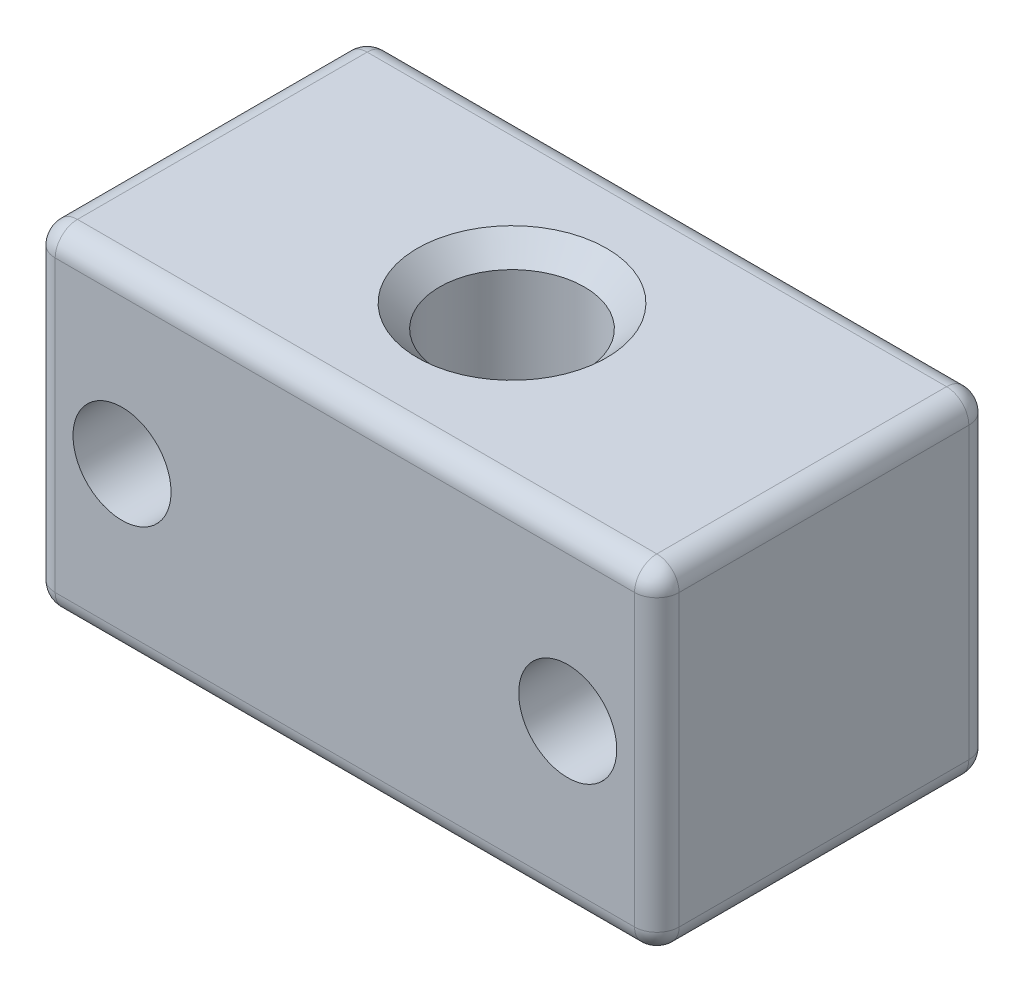
ISO-10303-21;
HEADER;
FILE_DESCRIPTION(('STEP AP214'),'2;1');
FILE_NAME('part.step','',(''),(''),'','','');
FILE_SCHEMA(('AUTOMOTIVE_DESIGN { 1 0 10303 214 1 1 1 1 }'));
ENDSEC;
DATA;
#1=APPLICATION_CONTEXT('core data for automotive mechanical design processes');
#2=APPLICATION_PROTOCOL_DEFINITION('international standard','automotive_design',2000,#1);
#3=PRODUCT_CONTEXT('',#1,'mechanical');
#4=PRODUCT('Part','Part','',(#3));
#5=PRODUCT_RELATED_PRODUCT_CATEGORY('part','',(#4));
#6=PRODUCT_DEFINITION_FORMATION('','',#4);
#7=PRODUCT_DEFINITION_CONTEXT('part definition',#1,'design');
#8=PRODUCT_DEFINITION('design','',#6,#7);
#9=PRODUCT_DEFINITION_SHAPE('','',#8);
#10=(LENGTH_UNIT() NAMED_UNIT(*) SI_UNIT(.MILLI.,.METRE.));
#11=(NAMED_UNIT(*) PLANE_ANGLE_UNIT() SI_UNIT($,.RADIAN.));
#12=(NAMED_UNIT(*) SI_UNIT($,.STERADIAN.) SOLID_ANGLE_UNIT());
#13=UNCERTAINTY_MEASURE_WITH_UNIT(LENGTH_MEASURE(1.E-05),#10,'distance_accuracy_value','');
#14=(GEOMETRIC_REPRESENTATION_CONTEXT(3) GLOBAL_UNCERTAINTY_ASSIGNED_CONTEXT((#13)) GLOBAL_UNIT_ASSIGNED_CONTEXT((#10,
#11,#12)) REPRESENTATION_CONTEXT('',''));
#15=CARTESIAN_POINT('',(0.,0.,0.));
#16=DIRECTION('',(0.,0.,1.));
#17=DIRECTION('',(1.,0.,0.));
#18=AXIS2_PLACEMENT_3D('',#15,#16,#17);
#19=CARTESIAN_POINT('',(0.,7.5,0.));
#20=DIRECTION('',(0.,-1.,0.));
#21=DIRECTION('',(0.,0.,-1.));
#22=AXIS2_PLACEMENT_3D('',#19,#20,#21);
#23=PLANE('',#22);
#24=CARTESIAN_POINT('',(0.,7.5,0.));
#25=DIRECTION('',(0.,-1.,0.));
#26=DIRECTION('',(0.,0.,-1.));
#27=AXIS2_PLACEMENT_3D('',#24,#25,#26);
#28=CIRCLE('',#27,4.25);
#29=CARTESIAN_POINT('',(0.,7.5,-4.25));
#30=VERTEX_POINT('',#29);
#31=EDGE_CURVE('E11',#30,#30,#28,.T.);
#32=ORIENTED_EDGE('',*,*,#31,.T.);
#33=EDGE_LOOP('',(#32));
#34=FACE_BOUND('',#33,.T.);
#35=DIRECTION('',(0.,0.,-1.));
#36=VECTOR('',#35,1.);
#37=CARTESIAN_POINT('',(13.,7.5,0.));
#38=LINE('',#37,#36);
#39=CARTESIAN_POINT('',(13.,7.5,6.5));
#40=VERTEX_POINT('',#39);
#41=CARTESIAN_POINT('',(13.,7.5,-6.5));
#42=VERTEX_POINT('',#41);
#43=EDGE_CURVE('E183',#40,#42,#38,.T.);
#44=ORIENTED_EDGE('',*,*,#43,.T.);
#45=DIRECTION('',(-1.,0.,0.));
#46=VECTOR('',#45,1.);
#47=CARTESIAN_POINT('',(0.,7.5,-6.5));
#48=LINE('',#47,#46);
#49=CARTESIAN_POINT('',(-13.,7.5,-6.5));
#50=VERTEX_POINT('',#49);
#51=EDGE_CURVE('E186',#42,#50,#48,.T.);
#52=ORIENTED_EDGE('',*,*,#51,.T.);
#53=DIRECTION('',(0.,0.,1.));
#54=VECTOR('',#53,1.);
#55=CARTESIAN_POINT('',(-13.,7.5,0.));
#56=LINE('',#55,#54);
#57=CARTESIAN_POINT('',(-13.,7.5,6.5));
#58=VERTEX_POINT('',#57);
#59=EDGE_CURVE('E181',#50,#58,#56,.T.);
#60=ORIENTED_EDGE('',*,*,#59,.T.);
#61=DIRECTION('',(1.,0.,0.));
#62=VECTOR('',#61,1.);
#63=CARTESIAN_POINT('',(0.,7.5,6.5));
#64=LINE('',#63,#62);
#65=EDGE_CURVE('E179',#58,#40,#64,.T.);
#66=ORIENTED_EDGE('',*,*,#65,.T.);
#67=EDGE_LOOP('',(#44,#52,#60,#66));
#68=FACE_BOUND('',#67,.T.);
#69=ADVANCED_FACE('F43',(#34,#68),#23,.F.);
#70=CARTESIAN_POINT('',(0.,-7.5,0.));
#71=DIRECTION('',(0.,-1.,0.));
#72=DIRECTION('',(0.,0.,-1.));
#73=AXIS2_PLACEMENT_3D('',#70,#71,#72);
#74=PLANE('',#73);
#75=CARTESIAN_POINT('',(0.,-7.5,0.));
#76=DIRECTION('',(0.,-1.,0.));
#77=DIRECTION('',(0.,0.,-1.));
#78=AXIS2_PLACEMENT_3D('',#75,#76,#77);
#79=CIRCLE('',#78,4.25);
#80=CARTESIAN_POINT('',(0.,-7.5,-4.25));
#81=VERTEX_POINT('',#80);
#82=EDGE_CURVE('E211',#81,#81,#79,.F.);
#83=ORIENTED_EDGE('',*,*,#82,.T.);
#84=EDGE_LOOP('',(#83));
#85=FACE_BOUND('',#84,.T.);
#86=DIRECTION('',(0.,0.,1.));
#87=VECTOR('',#86,1.);
#88=CARTESIAN_POINT('',(-13.,-7.5,-7.5));
#89=LINE('',#88,#87);
#90=CARTESIAN_POINT('',(-13.,-7.5,6.5));
#91=VERTEX_POINT('',#90);
#92=CARTESIAN_POINT('',(-13.,-7.5,-6.5));
#93=VERTEX_POINT('',#92);
#94=EDGE_CURVE('E199',#91,#93,#89,.F.);
#95=ORIENTED_EDGE('',*,*,#94,.T.);
#96=DIRECTION('',(-1.,0.,0.));
#97=VECTOR('',#96,1.);
#98=CARTESIAN_POINT('',(14.,-7.5,-6.5));
#99=LINE('',#98,#97);
#100=CARTESIAN_POINT('',(13.,-7.5,-6.5));
#101=VERTEX_POINT('',#100);
#102=EDGE_CURVE('E204',#93,#101,#99,.F.);
#103=ORIENTED_EDGE('',*,*,#102,.T.);
#104=DIRECTION('',(0.,0.,-1.));
#105=VECTOR('',#104,1.);
#106=CARTESIAN_POINT('',(13.,-7.5,7.5));
#107=LINE('',#106,#105);
#108=CARTESIAN_POINT('',(13.,-7.5,6.5));
#109=VERTEX_POINT('',#108);
#110=EDGE_CURVE('E201',#101,#109,#107,.F.);
#111=ORIENTED_EDGE('',*,*,#110,.T.);
#112=DIRECTION('',(1.,0.,0.));
#113=VECTOR('',#112,1.);
#114=CARTESIAN_POINT('',(-14.,-7.5,6.5));
#115=LINE('',#114,#113);
#116=EDGE_CURVE('E197',#109,#91,#115,.F.);
#117=ORIENTED_EDGE('',*,*,#116,.T.);
#118=EDGE_LOOP('',(#95,#103,#111,#117));
#119=FACE_BOUND('',#118,.T.);
#120=ADVANCED_FACE('F286',(#85,#119),#74,.T.);
#121=CARTESIAN_POINT('',(14.,7.5,7.5));
#122=DIRECTION('',(-1.,0.,0.));
#123=DIRECTION('',(0.,0.,1.));
#124=AXIS2_PLACEMENT_3D('',#121,#122,#123);
#125=PLANE('',#124);
#126=DIRECTION('',(0.,0.,-1.));
#127=VECTOR('',#126,1.);
#128=CARTESIAN_POINT('',(14.,6.5,7.5));
#129=LINE('',#128,#127);
#130=CARTESIAN_POINT('',(14.,6.5,-6.5));
#131=VERTEX_POINT('',#130);
#132=CARTESIAN_POINT('',(14.,6.5,6.5));
#133=VERTEX_POINT('',#132);
#134=EDGE_CURVE('E166',#131,#133,#129,.F.);
#135=ORIENTED_EDGE('',*,*,#134,.T.);
#136=DIRECTION('',(0.,-1.,0.));
#137=VECTOR('',#136,1.);
#138=CARTESIAN_POINT('',(14.,7.5,6.5));
#139=LINE('',#138,#137);
#140=CARTESIAN_POINT('',(14.,-6.5,6.5));
#141=VERTEX_POINT('',#140);
#142=EDGE_CURVE('E137',#133,#141,#139,.T.);
#143=ORIENTED_EDGE('',*,*,#142,.T.);
#144=DIRECTION('',(0.,0.,-1.));
#145=VECTOR('',#144,1.);
#146=CARTESIAN_POINT('',(14.,-6.5,-7.5));
#147=LINE('',#146,#145);
#148=CARTESIAN_POINT('',(14.,-6.5,-6.5));
#149=VERTEX_POINT('',#148);
#150=EDGE_CURVE('E155',#141,#149,#147,.T.);
#151=ORIENTED_EDGE('',*,*,#150,.T.);
#152=DIRECTION('',(0.,-1.,0.));
#153=VECTOR('',#152,1.);
#154=CARTESIAN_POINT('',(14.,7.5,-6.5));
#155=LINE('',#154,#153);
#156=EDGE_CURVE('E161',#149,#131,#155,.F.);
#157=ORIENTED_EDGE('',*,*,#156,.T.);
#158=EDGE_LOOP('',(#135,#143,#151,#157));
#159=FACE_BOUND('',#158,.T.);
#160=ADVANCED_FACE('F164',(#159),#125,.F.);
#161=CARTESIAN_POINT('',(-14.,7.5,-7.5));
#162=DIRECTION('',(0.,0.,1.));
#163=DIRECTION('',(1.,0.,0.));
#164=AXIS2_PLACEMENT_3D('',#161,#162,#163);
#165=PLANE('',#164);
#166=DIRECTION('',(0.,-1.,0.));
#167=VECTOR('',#166,1.);
#168=CARTESIAN_POINT('',(13.,7.5,-7.5));
#169=LINE('',#168,#167);
#170=CARTESIAN_POINT('',(13.,6.5,-7.5));
#171=VERTEX_POINT('',#170);
#172=CARTESIAN_POINT('',(13.,-6.5,-7.5));
#173=VERTEX_POINT('',#172);
#174=EDGE_CURVE('E192',#171,#173,#169,.T.);
#175=ORIENTED_EDGE('',*,*,#174,.T.);
#176=DIRECTION('',(-1.,0.,0.));
#177=VECTOR('',#176,1.);
#178=CARTESIAN_POINT('',(-14.,-6.5,-7.5));
#179=LINE('',#178,#177);
#180=CARTESIAN_POINT('',(-13.,-6.5,-7.5));
#181=VERTEX_POINT('',#180);
#182=EDGE_CURVE('E195',#173,#181,#179,.T.);
#183=ORIENTED_EDGE('',*,*,#182,.T.);
#184=DIRECTION('',(0.,-1.,0.));
#185=VECTOR('',#184,1.);
#186=CARTESIAN_POINT('',(-13.,7.5,-7.5));
#187=LINE('',#186,#185);
#188=CARTESIAN_POINT('',(-13.,6.5,-7.5));
#189=VERTEX_POINT('',#188);
#190=EDGE_CURVE('E190',#181,#189,#187,.F.);
#191=ORIENTED_EDGE('',*,*,#190,.T.);
#192=DIRECTION('',(-1.,0.,0.));
#193=VECTOR('',#192,1.);
#194=CARTESIAN_POINT('',(-14.,6.5,-7.5));
#195=LINE('',#194,#193);
#196=EDGE_CURVE('E188',#189,#171,#195,.F.);
#197=ORIENTED_EDGE('',*,*,#196,.T.);
#198=EDGE_LOOP('',(#175,#183,#191,#197));
#199=FACE_BOUND('',#198,.T.);
#200=CARTESIAN_POINT('',(-10.,0.,-7.5));
#201=DIRECTION('',(0.,0.,1.));
#202=DIRECTION('',(1.,0.,0.));
#203=AXIS2_PLACEMENT_3D('',#200,#201,#202);
#204=CIRCLE('',#203,2.2);
#205=CARTESIAN_POINT('',(-7.8,0.,-7.5));
#206=VERTEX_POINT('',#205);
#207=EDGE_CURVE('E162',#206,#206,#204,.T.);
#208=ORIENTED_EDGE('',*,*,#207,.T.);
#209=EDGE_LOOP('',(#208));
#210=FACE_BOUND('',#209,.T.);
#211=CARTESIAN_POINT('',(10.,0.,-7.5));
#212=DIRECTION('',(0.,0.,1.));
#213=DIRECTION('',(1.,0.,0.));
#214=AXIS2_PLACEMENT_3D('',#211,#212,#213);
#215=CIRCLE('',#214,2.2);
#216=CARTESIAN_POINT('',(12.2,0.,-7.5));
#217=VERTEX_POINT('',#216);
#218=EDGE_CURVE('E270',#217,#217,#215,.T.);
#219=ORIENTED_EDGE('',*,*,#218,.T.);
#220=EDGE_LOOP('',(#219));
#221=FACE_BOUND('',#220,.T.);
#222=ADVANCED_FACE('F325',(#199,#210,#221),#165,.F.);
#223=CARTESIAN_POINT('',(-14.,7.5,7.5));
#224=DIRECTION('',(1.,0.,0.));
#225=DIRECTION('',(0.,0.,-1.));
#226=AXIS2_PLACEMENT_3D('',#223,#224,#225);
#227=PLANE('',#226);
#228=DIRECTION('',(0.,0.,1.));
#229=VECTOR('',#228,1.);
#230=CARTESIAN_POINT('',(-14.,6.5,7.5));
#231=LINE('',#230,#229);
#232=CARTESIAN_POINT('',(-14.,6.5,6.5));
#233=VERTEX_POINT('',#232);
#234=CARTESIAN_POINT('',(-14.,6.5,-6.5));
#235=VERTEX_POINT('',#234);
#236=EDGE_CURVE('E59',#233,#235,#231,.F.);
#237=ORIENTED_EDGE('',*,*,#236,.T.);
#238=DIRECTION('',(0.,-1.,0.));
#239=VECTOR('',#238,1.);
#240=CARTESIAN_POINT('',(-14.,7.5,-6.5));
#241=LINE('',#240,#239);
#242=CARTESIAN_POINT('',(-14.,-6.5,-6.5));
#243=VERTEX_POINT('',#242);
#244=EDGE_CURVE('E210',#235,#243,#241,.T.);
#245=ORIENTED_EDGE('',*,*,#244,.T.);
#246=DIRECTION('',(0.,0.,1.));
#247=VECTOR('',#246,1.);
#248=CARTESIAN_POINT('',(-14.,-6.5,7.5));
#249=LINE('',#248,#247);
#250=CARTESIAN_POINT('',(-14.,-6.5,6.5));
#251=VERTEX_POINT('',#250);
#252=EDGE_CURVE('E206',#243,#251,#249,.T.);
#253=ORIENTED_EDGE('',*,*,#252,.T.);
#254=DIRECTION('',(0.,-1.,0.));
#255=VECTOR('',#254,1.);
#256=CARTESIAN_POINT('',(-14.,7.5,6.5));
#257=LINE('',#256,#255);
#258=EDGE_CURVE('E64',#251,#233,#257,.F.);
#259=ORIENTED_EDGE('',*,*,#258,.T.);
#260=EDGE_LOOP('',(#237,#245,#253,#259));
#261=FACE_BOUND('',#260,.T.);
#262=ADVANCED_FACE('F339',(#261),#227,.F.);
#263=CARTESIAN_POINT('',(-14.,7.5,7.5));
#264=DIRECTION('',(0.,0.,-1.));
#265=DIRECTION('',(-1.,0.,0.));
#266=AXIS2_PLACEMENT_3D('',#263,#264,#265);
#267=PLANE('',#266);
#268=DIRECTION('',(0.,-1.,0.));
#269=VECTOR('',#268,1.);
#270=CARTESIAN_POINT('',(-13.,7.5,7.5));
#271=LINE('',#270,#269);
#272=CARTESIAN_POINT('',(-13.,6.5,7.5));
#273=VERTEX_POINT('',#272);
#274=CARTESIAN_POINT('',(-13.,-6.5,7.5));
#275=VERTEX_POINT('',#274);
#276=EDGE_CURVE('E170',#273,#275,#271,.T.);
#277=ORIENTED_EDGE('',*,*,#276,.T.);
#278=DIRECTION('',(1.,0.,0.));
#279=VECTOR('',#278,1.);
#280=CARTESIAN_POINT('',(14.,-6.5,7.5));
#281=LINE('',#280,#279);
#282=CARTESIAN_POINT('',(13.,-6.5,7.5));
#283=VERTEX_POINT('',#282);
#284=EDGE_CURVE('E177',#275,#283,#281,.T.);
#285=ORIENTED_EDGE('',*,*,#284,.T.);
#286=DIRECTION('',(0.,-1.,0.));
#287=VECTOR('',#286,1.);
#288=CARTESIAN_POINT('',(13.,7.5,7.5));
#289=LINE('',#288,#287);
#290=CARTESIAN_POINT('',(13.,6.5,7.5));
#291=VERTEX_POINT('',#290);
#292=EDGE_CURVE('E139',#283,#291,#289,.F.);
#293=ORIENTED_EDGE('',*,*,#292,.T.);
#294=DIRECTION('',(1.,0.,0.));
#295=VECTOR('',#294,1.);
#296=CARTESIAN_POINT('',(-14.,6.5,7.5));
#297=LINE('',#296,#295);
#298=EDGE_CURVE('E168',#291,#273,#297,.F.);
#299=ORIENTED_EDGE('',*,*,#298,.T.);
#300=EDGE_LOOP('',(#277,#285,#293,#299));
#301=FACE_BOUND('',#300,.T.);
#302=CARTESIAN_POINT('',(-10.,0.,7.5));
#303=DIRECTION('',(0.,0.,1.));
#304=DIRECTION('',(1.,0.,0.));
#305=AXIS2_PLACEMENT_3D('',#302,#303,#304);
#306=CIRCLE('',#305,2.2);
#307=CARTESIAN_POINT('',(-7.8,0.,7.5));
#308=VERTEX_POINT('',#307);
#309=EDGE_CURVE('E319',#308,#308,#306,.T.);
#310=ORIENTED_EDGE('',*,*,#309,.F.);
#311=EDGE_LOOP('',(#310));
#312=FACE_BOUND('',#311,.T.);
#313=CARTESIAN_POINT('',(10.,0.,7.5));
#314=DIRECTION('',(0.,0.,1.));
#315=DIRECTION('',(1.,0.,0.));
#316=AXIS2_PLACEMENT_3D('',#313,#314,#315);
#317=CIRCLE('',#316,2.2);
#318=CARTESIAN_POINT('',(12.2,0.,7.5));
#319=VERTEX_POINT('',#318);
#320=EDGE_CURVE('E316',#319,#319,#317,.T.);
#321=ORIENTED_EDGE('',*,*,#320,.F.);
#322=EDGE_LOOP('',(#321));
#323=FACE_BOUND('',#322,.T.);
#324=ADVANCED_FACE('F336',(#301,#312,#323),#267,.F.);
#325=CARTESIAN_POINT('',(0.,7.5,0.));
#326=DIRECTION('',(0.,-1.,0.));
#327=DIRECTION('',(0.,0.,-1.));
#328=AXIS2_PLACEMENT_3D('',#325,#326,#327);
#329=CYLINDRICAL_SURFACE('',#328,3.25);
#330=CARTESIAN_POINT('',(0.,-6.49999999999999,0.));
#331=DIRECTION('',(0.,-1.,0.));
#332=DIRECTION('',(0.,0.,-1.));
#333=AXIS2_PLACEMENT_3D('',#330,#331,#332);
#334=CIRCLE('',#333,3.25);
#335=CARTESIAN_POINT('',(0.,-6.49999999999999,-3.25));
#336=VERTEX_POINT('',#335);
#337=EDGE_CURVE('E52',#336,#336,#334,.T.);
#338=ORIENTED_EDGE('',*,*,#337,.T.);
#339=EDGE_LOOP('',(#338));
#340=FACE_BOUND('',#339,.T.);
#341=CARTESIAN_POINT('',(0.,6.5,0.));
#342=DIRECTION('',(0.,-1.,0.));
#343=DIRECTION('',(0.,0.,-1.));
#344=AXIS2_PLACEMENT_3D('',#341,#342,#343);
#345=CIRCLE('',#344,3.25);
#346=CARTESIAN_POINT('',(0.,6.5,-3.25));
#347=VERTEX_POINT('',#346);
#348=EDGE_CURVE('E273',#347,#347,#345,.F.);
#349=ORIENTED_EDGE('',*,*,#348,.T.);
#350=EDGE_LOOP('',(#349));
#351=FACE_BOUND('',#350,.T.);
#352=ADVANCED_FACE('F278',(#340,#351),#329,.F.);
#353=CARTESIAN_POINT('',(10.,0.,-7.5));
#354=DIRECTION('',(0.,0.,1.));
#355=DIRECTION('',(1.,0.,0.));
#356=AXIS2_PLACEMENT_3D('',#353,#354,#355);
#357=CYLINDRICAL_SURFACE('',#356,2.2);
#358=ORIENTED_EDGE('',*,*,#218,.F.);
#359=EDGE_LOOP('',(#358));
#360=FACE_BOUND('',#359,.T.);
#361=ORIENTED_EDGE('',*,*,#320,.T.);
#362=EDGE_LOOP('',(#361));
#363=FACE_BOUND('',#362,.T.);
#364=ADVANCED_FACE('F332',(#360,#363),#357,.F.);
#365=CARTESIAN_POINT('',(-10.,0.,-7.5));
#366=DIRECTION('',(0.,0.,1.));
#367=DIRECTION('',(1.,0.,0.));
#368=AXIS2_PLACEMENT_3D('',#365,#366,#367);
#369=CYLINDRICAL_SURFACE('',#368,2.2);
#370=ORIENTED_EDGE('',*,*,#207,.F.);
#371=EDGE_LOOP('',(#370));
#372=FACE_BOUND('',#371,.T.);
#373=ORIENTED_EDGE('',*,*,#309,.T.);
#374=EDGE_LOOP('',(#373));
#375=FACE_BOUND('',#374,.T.);
#376=ADVANCED_FACE('F328',(#372,#375),#369,.F.);
#377=CARTESIAN_POINT('',(-13.,7.5,-6.5));
#378=DIRECTION('',(0.,-1.,0.));
#379=DIRECTION('',(0.,0.,-1.));
#380=AXIS2_PLACEMENT_3D('',#377,#378,#379);
#381=CYLINDRICAL_SURFACE('',#380,1.);
#382=CARTESIAN_POINT('',(-13.,6.5,-6.5));
#383=DIRECTION('',(0.,1.,0.));
#384=DIRECTION('',(0.,0.,1.));
#385=AXIS2_PLACEMENT_3D('',#382,#383,#384);
#386=CIRCLE('',#385,1.);
#387=EDGE_CURVE('E267',#189,#235,#386,.T.);
#388=ORIENTED_EDGE('',*,*,#387,.F.);
#389=ORIENTED_EDGE('',*,*,#190,.F.);
#390=CARTESIAN_POINT('',(-13.,-6.5,-6.5));
#391=DIRECTION('',(0.,-1.,0.));
#392=DIRECTION('',(0.,0.,-1.));
#393=AXIS2_PLACEMENT_3D('',#390,#391,#392);
#394=CIRCLE('',#393,1.);
#395=EDGE_CURVE('E264',#243,#181,#394,.T.);
#396=ORIENTED_EDGE('',*,*,#395,.F.);
#397=ORIENTED_EDGE('',*,*,#244,.F.);
#398=EDGE_LOOP('',(#388,#389,#396,#397));
#399=FACE_BOUND('',#398,.T.);
#400=ADVANCED_FACE('F331',(#399),#381,.T.);
#401=CARTESIAN_POINT('',(-13.,6.5,-6.5));
#402=DIRECTION('',(-1.,0.,0.));
#403=DIRECTION('',(0.,0.,1.));
#404=AXIS2_PLACEMENT_3D('',#401,#402,#403);
#405=SPHERICAL_SURFACE('',#404,1.);
#406=CARTESIAN_POINT('',(-13.,6.5,-6.5));
#407=DIRECTION('',(-1.,0.,0.));
#408=DIRECTION('',(0.,0.,1.));
#409=AXIS2_PLACEMENT_3D('',#406,#407,#408);
#410=CIRCLE('',#409,1.);
#411=EDGE_CURVE('E258',#189,#50,#410,.F.);
#412=ORIENTED_EDGE('',*,*,#411,.F.);
#413=ORIENTED_EDGE('',*,*,#387,.T.);
#414=CARTESIAN_POINT('',(-13.,6.5,-6.5));
#415=DIRECTION('',(0.,0.,-1.));
#416=DIRECTION('',(0.,1.,0.));
#417=AXIS2_PLACEMENT_3D('',#414,#415,#416);
#418=CIRCLE('',#417,1.);
#419=EDGE_CURVE('E261',#50,#235,#418,.F.);
#420=ORIENTED_EDGE('',*,*,#419,.F.);
#421=EDGE_LOOP('',(#412,#413,#420));
#422=FACE_BOUND('',#421,.T.);
#423=ADVANCED_FACE('F422',(#422),#405,.T.);
#424=CARTESIAN_POINT('',(-13.,-6.5,-6.5));
#425=DIRECTION('',(0.,0.,-1.));
#426=DIRECTION('',(0.,1.,0.));
#427=AXIS2_PLACEMENT_3D('',#424,#425,#426);
#428=SPHERICAL_SURFACE('',#427,1.);
#429=CARTESIAN_POINT('',(-13.,-6.5,-6.5));
#430=DIRECTION('',(0.,0.,-1.));
#431=DIRECTION('',(-1.,0.,0.));
#432=AXIS2_PLACEMENT_3D('',#429,#430,#431);
#433=CIRCLE('',#432,1.);
#434=EDGE_CURVE('E252',#243,#93,#433,.F.);
#435=ORIENTED_EDGE('',*,*,#434,.F.);
#436=ORIENTED_EDGE('',*,*,#395,.T.);
#437=CARTESIAN_POINT('',(-13.,-6.5,-6.5));
#438=DIRECTION('',(-1.,0.,0.));
#439=DIRECTION('',(0.,0.,1.));
#440=AXIS2_PLACEMENT_3D('',#437,#438,#439);
#441=CIRCLE('',#440,1.);
#442=EDGE_CURVE('E255',#93,#181,#441,.F.);
#443=ORIENTED_EDGE('',*,*,#442,.F.);
#444=EDGE_LOOP('',(#435,#436,#443));
#445=FACE_BOUND('',#444,.T.);
#446=ADVANCED_FACE('F300',(#445),#428,.T.);
#447=CARTESIAN_POINT('',(-13.,6.5,0.));
#448=DIRECTION('',(0.,0.,1.));
#449=DIRECTION('',(1.,0.,0.));
#450=AXIS2_PLACEMENT_3D('',#447,#448,#449);
#451=CYLINDRICAL_SURFACE('',#450,1.);
#452=ORIENTED_EDGE('',*,*,#419,.T.);
#453=ORIENTED_EDGE('',*,*,#236,.F.);
#454=CARTESIAN_POINT('',(-13.,6.5,6.5));
#455=DIRECTION('',(0.,0.,1.));
#456=DIRECTION('',(1.,0.,0.));
#457=AXIS2_PLACEMENT_3D('',#454,#455,#456);
#458=CIRCLE('',#457,1.);
#459=EDGE_CURVE('E246',#58,#233,#458,.T.);
#460=ORIENTED_EDGE('',*,*,#459,.F.);
#461=ORIENTED_EDGE('',*,*,#59,.F.);
#462=EDGE_LOOP('',(#452,#453,#460,#461));
#463=FACE_BOUND('',#462,.T.);
#464=ADVANCED_FACE('F415',(#463),#451,.T.);
#465=CARTESIAN_POINT('',(0.,6.5,-6.5));
#466=DIRECTION('',(-1.,0.,0.));
#467=DIRECTION('',(0.,0.,1.));
#468=AXIS2_PLACEMENT_3D('',#465,#466,#467);
#469=CYLINDRICAL_SURFACE('',#468,1.);
#470=ORIENTED_EDGE('',*,*,#411,.T.);
#471=ORIENTED_EDGE('',*,*,#51,.F.);
#472=CARTESIAN_POINT('',(13.,6.5,-6.5));
#473=DIRECTION('',(1.,0.,0.));
#474=DIRECTION('',(0.,0.,-1.));
#475=AXIS2_PLACEMENT_3D('',#472,#473,#474);
#476=CIRCLE('',#475,1.);
#477=EDGE_CURVE('E243',#171,#42,#476,.T.);
#478=ORIENTED_EDGE('',*,*,#477,.F.);
#479=ORIENTED_EDGE('',*,*,#196,.F.);
#480=EDGE_LOOP('',(#470,#471,#478,#479));
#481=FACE_BOUND('',#480,.T.);
#482=ADVANCED_FACE('F412',(#481),#469,.T.);
#483=CARTESIAN_POINT('',(13.,7.5,-6.5));
#484=DIRECTION('',(0.,-1.,0.));
#485=DIRECTION('',(0.,0.,-1.));
#486=AXIS2_PLACEMENT_3D('',#483,#484,#485);
#487=CYLINDRICAL_SURFACE('',#486,1.);
#488=CARTESIAN_POINT('',(13.,-6.5,-6.5));
#489=DIRECTION('',(0.,-1.,0.));
#490=DIRECTION('',(0.,0.,-1.));
#491=AXIS2_PLACEMENT_3D('',#488,#489,#490);
#492=CIRCLE('',#491,1.);
#493=EDGE_CURVE('E237',#173,#149,#492,.T.);
#494=ORIENTED_EDGE('',*,*,#493,.F.);
#495=ORIENTED_EDGE('',*,*,#174,.F.);
#496=CARTESIAN_POINT('',(13.,6.5,-6.5));
#497=DIRECTION('',(0.,1.,0.));
#498=DIRECTION('',(0.,0.,1.));
#499=AXIS2_PLACEMENT_3D('',#496,#497,#498);
#500=CIRCLE('',#499,1.);
#501=EDGE_CURVE('E240',#131,#171,#500,.T.);
#502=ORIENTED_EDGE('',*,*,#501,.F.);
#503=ORIENTED_EDGE('',*,*,#156,.F.);
#504=EDGE_LOOP('',(#494,#495,#502,#503));
#505=FACE_BOUND('',#504,.T.);
#506=ADVANCED_FACE('F309',(#505),#487,.T.);
#507=CARTESIAN_POINT('',(-14.,-6.5,-6.5));
#508=DIRECTION('',(1.,0.,0.));
#509=DIRECTION('',(0.,0.,-1.));
#510=AXIS2_PLACEMENT_3D('',#507,#508,#509);
#511=CYLINDRICAL_SURFACE('',#510,1.);
#512=ORIENTED_EDGE('',*,*,#442,.T.);
#513=ORIENTED_EDGE('',*,*,#182,.F.);
#514=CARTESIAN_POINT('',(13.,-6.5,-6.5));
#515=DIRECTION('',(1.,0.,0.));
#516=DIRECTION('',(0.,0.,-1.));
#517=AXIS2_PLACEMENT_3D('',#514,#515,#516);
#518=CIRCLE('',#517,1.);
#519=EDGE_CURVE('E235',#101,#173,#518,.T.);
#520=ORIENTED_EDGE('',*,*,#519,.F.);
#521=ORIENTED_EDGE('',*,*,#102,.F.);
#522=EDGE_LOOP('',(#512,#513,#520,#521));
#523=FACE_BOUND('',#522,.T.);
#524=ADVANCED_FACE('F303',(#523),#511,.T.);
#525=CARTESIAN_POINT('',(-13.,-6.5,7.5));
#526=DIRECTION('',(0.,0.,-1.));
#527=DIRECTION('',(-1.,0.,0.));
#528=AXIS2_PLACEMENT_3D('',#525,#526,#527);
#529=CYLINDRICAL_SURFACE('',#528,1.);
#530=ORIENTED_EDGE('',*,*,#434,.T.);
#531=ORIENTED_EDGE('',*,*,#94,.F.);
#532=CARTESIAN_POINT('',(-13.,-6.5,6.5));
#533=DIRECTION('',(0.,0.,1.));
#534=DIRECTION('',(1.,0.,0.));
#535=AXIS2_PLACEMENT_3D('',#532,#533,#534);
#536=CIRCLE('',#535,1.);
#537=EDGE_CURVE('E232',#251,#91,#536,.T.);
#538=ORIENTED_EDGE('',*,*,#537,.F.);
#539=ORIENTED_EDGE('',*,*,#252,.F.);
#540=EDGE_LOOP('',(#530,#531,#538,#539));
#541=FACE_BOUND('',#540,.T.);
#542=ADVANCED_FACE('F297',(#541),#529,.T.);
#543=CARTESIAN_POINT('',(-13.,7.5,6.5));
#544=DIRECTION('',(0.,-1.,0.));
#545=DIRECTION('',(0.,0.,-1.));
#546=AXIS2_PLACEMENT_3D('',#543,#544,#545);
#547=CYLINDRICAL_SURFACE('',#546,1.);
#548=CARTESIAN_POINT('',(-13.,6.5,6.5));
#549=DIRECTION('',(0.,1.,0.));
#550=DIRECTION('',(0.,0.,1.));
#551=AXIS2_PLACEMENT_3D('',#548,#549,#550);
#552=CIRCLE('',#551,1.);
#553=EDGE_CURVE('E249',#233,#273,#552,.T.);
#554=ORIENTED_EDGE('',*,*,#553,.F.);
#555=ORIENTED_EDGE('',*,*,#258,.F.);
#556=CARTESIAN_POINT('',(-13.,-6.5,6.5));
#557=DIRECTION('',(0.,-1.,0.));
#558=DIRECTION('',(0.,0.,-1.));
#559=AXIS2_PLACEMENT_3D('',#556,#557,#558);
#560=CIRCLE('',#559,1.);
#561=EDGE_CURVE('E229',#275,#251,#560,.T.);
#562=ORIENTED_EDGE('',*,*,#561,.F.);
#563=ORIENTED_EDGE('',*,*,#276,.F.);
#564=EDGE_LOOP('',(#554,#555,#562,#563));
#565=FACE_BOUND('',#564,.T.);
#566=ADVANCED_FACE('F401',(#565),#547,.T.);
#567=CARTESIAN_POINT('',(-13.,6.5,6.5));
#568=DIRECTION('',(-1.,0.,0.));
#569=DIRECTION('',(0.,0.,1.));
#570=AXIS2_PLACEMENT_3D('',#567,#568,#569);
#571=SPHERICAL_SURFACE('',#570,1.);
#572=ORIENTED_EDGE('',*,*,#459,.T.);
#573=ORIENTED_EDGE('',*,*,#553,.T.);
#574=CARTESIAN_POINT('',(-13.,6.5,6.5));
#575=DIRECTION('',(-1.,0.,0.));
#576=DIRECTION('',(0.,0.,1.));
#577=AXIS2_PLACEMENT_3D('',#574,#575,#576);
#578=CIRCLE('',#577,1.);
#579=EDGE_CURVE('E226',#58,#273,#578,.F.);
#580=ORIENTED_EDGE('',*,*,#579,.F.);
#581=EDGE_LOOP('',(#572,#573,#580));
#582=FACE_BOUND('',#581,.T.);
#583=ADVANCED_FACE('F397',(#582),#571,.T.);
#584=CARTESIAN_POINT('',(13.,6.5,-6.5));
#585=DIRECTION('',(0.,0.,-1.));
#586=DIRECTION('',(-1.,0.,0.));
#587=AXIS2_PLACEMENT_3D('',#584,#585,#586);
#588=SPHERICAL_SURFACE('',#587,1.);
#589=ORIENTED_EDGE('',*,*,#501,.T.);
#590=ORIENTED_EDGE('',*,*,#477,.T.);
#591=CARTESIAN_POINT('',(13.,6.5,-6.5));
#592=DIRECTION('',(0.,0.,-1.));
#593=DIRECTION('',(-1.,0.,0.));
#594=AXIS2_PLACEMENT_3D('',#591,#592,#593);
#595=CIRCLE('',#594,1.);
#596=EDGE_CURVE('E224',#131,#42,#595,.F.);
#597=ORIENTED_EDGE('',*,*,#596,.F.);
#598=EDGE_LOOP('',(#589,#590,#597));
#599=FACE_BOUND('',#598,.T.);
#600=ADVANCED_FACE('F394',(#599),#588,.T.);
#601=CARTESIAN_POINT('',(13.,-6.5,-6.5));
#602=DIRECTION('',(0.,0.,-1.));
#603=DIRECTION('',(0.,1.,0.));
#604=AXIS2_PLACEMENT_3D('',#601,#602,#603);
#605=SPHERICAL_SURFACE('',#604,1.);
#606=ORIENTED_EDGE('',*,*,#519,.T.);
#607=ORIENTED_EDGE('',*,*,#493,.T.);
#608=CARTESIAN_POINT('',(13.,-6.5,-6.5));
#609=DIRECTION('',(0.,0.,-1.));
#610=DIRECTION('',(-1.,0.,0.));
#611=AXIS2_PLACEMENT_3D('',#608,#609,#610);
#612=CIRCLE('',#611,1.);
#613=EDGE_CURVE('E158',#101,#149,#612,.F.);
#614=ORIENTED_EDGE('',*,*,#613,.F.);
#615=EDGE_LOOP('',(#606,#607,#614));
#616=FACE_BOUND('',#615,.T.);
#617=ADVANCED_FACE('F306',(#616),#605,.T.);
#618=CARTESIAN_POINT('',(-13.,-6.5,6.5));
#619=DIRECTION('',(-1.,0.,0.));
#620=DIRECTION('',(0.,-1.,0.));
#621=AXIS2_PLACEMENT_3D('',#618,#619,#620);
#622=SPHERICAL_SURFACE('',#621,1.);
#623=ORIENTED_EDGE('',*,*,#561,.T.);
#624=ORIENTED_EDGE('',*,*,#537,.T.);
#625=CARTESIAN_POINT('',(-13.,-6.5,6.5));
#626=DIRECTION('',(-1.,0.,0.));
#627=DIRECTION('',(0.,0.,1.));
#628=AXIS2_PLACEMENT_3D('',#625,#626,#627);
#629=CIRCLE('',#628,1.);
#630=EDGE_CURVE('E220',#275,#91,#629,.F.);
#631=ORIENTED_EDGE('',*,*,#630,.F.);
#632=EDGE_LOOP('',(#623,#624,#631));
#633=FACE_BOUND('',#632,.T.);
#634=ADVANCED_FACE('F387',(#633),#622,.T.);
#635=CARTESIAN_POINT('',(0.,6.5,6.5));
#636=DIRECTION('',(1.,0.,0.));
#637=DIRECTION('',(0.,0.,-1.));
#638=AXIS2_PLACEMENT_3D('',#635,#636,#637);
#639=CYLINDRICAL_SURFACE('',#638,1.);
#640=ORIENTED_EDGE('',*,*,#579,.T.);
#641=ORIENTED_EDGE('',*,*,#298,.F.);
#642=CARTESIAN_POINT('',(13.,6.5,6.5));
#643=DIRECTION('',(1.,0.,0.));
#644=DIRECTION('',(0.,0.,-1.));
#645=AXIS2_PLACEMENT_3D('',#642,#643,#644);
#646=CIRCLE('',#645,1.);
#647=EDGE_CURVE('E217',#40,#291,#646,.T.);
#648=ORIENTED_EDGE('',*,*,#647,.F.);
#649=ORIENTED_EDGE('',*,*,#65,.F.);
#650=EDGE_LOOP('',(#640,#641,#648,#649));
#651=FACE_BOUND('',#650,.T.);
#652=ADVANCED_FACE('F383',(#651),#639,.T.);
#653=CARTESIAN_POINT('',(13.,6.5,0.));
#654=DIRECTION('',(0.,0.,-1.));
#655=DIRECTION('',(-1.,0.,0.));
#656=AXIS2_PLACEMENT_3D('',#653,#654,#655);
#657=CYLINDRICAL_SURFACE('',#656,1.);
#658=ORIENTED_EDGE('',*,*,#596,.T.);
#659=ORIENTED_EDGE('',*,*,#43,.F.);
#660=CARTESIAN_POINT('',(13.,6.5,6.5));
#661=DIRECTION('',(0.,0.,1.));
#662=DIRECTION('',(1.,0.,0.));
#663=AXIS2_PLACEMENT_3D('',#660,#661,#662);
#664=CIRCLE('',#663,1.);
#665=EDGE_CURVE('E152',#133,#40,#664,.T.);
#666=ORIENTED_EDGE('',*,*,#665,.F.);
#667=ORIENTED_EDGE('',*,*,#134,.F.);
#668=EDGE_LOOP('',(#658,#659,#666,#667));
#669=FACE_BOUND('',#668,.T.);
#670=ADVANCED_FACE('F380',(#669),#657,.T.);
#671=CARTESIAN_POINT('',(13.,-6.5,7.5));
#672=DIRECTION('',(0.,0.,1.));
#673=DIRECTION('',(1.,0.,0.));
#674=AXIS2_PLACEMENT_3D('',#671,#672,#673);
#675=CYLINDRICAL_SURFACE('',#674,1.);
#676=ORIENTED_EDGE('',*,*,#613,.T.);
#677=ORIENTED_EDGE('',*,*,#150,.F.);
#678=CARTESIAN_POINT('',(13.,-6.5,6.5));
#679=DIRECTION('',(0.,0.,1.));
#680=DIRECTION('',(1.,0.,0.));
#681=AXIS2_PLACEMENT_3D('',#678,#679,#680);
#682=CIRCLE('',#681,1.);
#683=EDGE_CURVE('E144',#109,#141,#682,.T.);
#684=ORIENTED_EDGE('',*,*,#683,.F.);
#685=ORIENTED_EDGE('',*,*,#110,.F.);
#686=EDGE_LOOP('',(#676,#677,#684,#685));
#687=FACE_BOUND('',#686,.T.);
#688=ADVANCED_FACE('F156',(#687),#675,.T.);
#689=CARTESIAN_POINT('',(-14.,-6.5,6.5));
#690=DIRECTION('',(-1.,0.,0.));
#691=DIRECTION('',(0.,0.,1.));
#692=AXIS2_PLACEMENT_3D('',#689,#690,#691);
#693=CYLINDRICAL_SURFACE('',#692,1.);
#694=ORIENTED_EDGE('',*,*,#630,.T.);
#695=ORIENTED_EDGE('',*,*,#116,.F.);
#696=CARTESIAN_POINT('',(13.,-6.5,6.5));
#697=DIRECTION('',(1.,0.,0.));
#698=DIRECTION('',(0.,0.,-1.));
#699=AXIS2_PLACEMENT_3D('',#696,#697,#698);
#700=CIRCLE('',#699,1.);
#701=EDGE_CURVE('E148',#283,#109,#700,.T.);
#702=ORIENTED_EDGE('',*,*,#701,.F.);
#703=ORIENTED_EDGE('',*,*,#284,.F.);
#704=EDGE_LOOP('',(#694,#695,#702,#703));
#705=FACE_BOUND('',#704,.T.);
#706=ADVANCED_FACE('F373',(#705),#693,.T.);
#707=CARTESIAN_POINT('',(13.,6.5,6.5));
#708=DIRECTION('',(0.,1.,0.));
#709=DIRECTION('',(0.,0.,1.));
#710=AXIS2_PLACEMENT_3D('',#707,#708,#709);
#711=SPHERICAL_SURFACE('',#710,1.);
#712=ORIENTED_EDGE('',*,*,#665,.T.);
#713=ORIENTED_EDGE('',*,*,#647,.T.);
#714=CARTESIAN_POINT('',(13.,6.5,6.5));
#715=DIRECTION('',(0.,1.,0.));
#716=DIRECTION('',(0.,0.,1.));
#717=AXIS2_PLACEMENT_3D('',#714,#715,#716);
#718=CIRCLE('',#717,1.);
#719=EDGE_CURVE('E141',#133,#291,#718,.F.);
#720=ORIENTED_EDGE('',*,*,#719,.F.);
#721=EDGE_LOOP('',(#712,#713,#720));
#722=FACE_BOUND('',#721,.T.);
#723=ADVANCED_FACE('F370',(#722),#711,.T.);
#724=CARTESIAN_POINT('',(13.,-6.5,6.5));
#725=DIRECTION('',(0.,-1.,0.));
#726=DIRECTION('',(0.,0.,-1.));
#727=AXIS2_PLACEMENT_3D('',#724,#725,#726);
#728=SPHERICAL_SURFACE('',#727,1.);
#729=ORIENTED_EDGE('',*,*,#701,.T.);
#730=ORIENTED_EDGE('',*,*,#683,.T.);
#731=CARTESIAN_POINT('',(13.,-6.5,6.5));
#732=DIRECTION('',(0.,-1.,0.));
#733=DIRECTION('',(0.,0.,-1.));
#734=AXIS2_PLACEMENT_3D('',#731,#732,#733);
#735=CIRCLE('',#734,1.);
#736=EDGE_CURVE('E133',#283,#141,#735,.F.);
#737=ORIENTED_EDGE('',*,*,#736,.F.);
#738=EDGE_LOOP('',(#729,#730,#737));
#739=FACE_BOUND('',#738,.T.);
#740=ADVANCED_FACE('F146',(#739),#728,.T.);
#741=CARTESIAN_POINT('',(13.,7.5,6.5));
#742=DIRECTION('',(0.,-1.,0.));
#743=DIRECTION('',(0.,0.,-1.));
#744=AXIS2_PLACEMENT_3D('',#741,#742,#743);
#745=CYLINDRICAL_SURFACE('',#744,1.);
#746=ORIENTED_EDGE('',*,*,#719,.T.);
#747=ORIENTED_EDGE('',*,*,#292,.F.);
#748=ORIENTED_EDGE('',*,*,#736,.T.);
#749=ORIENTED_EDGE('',*,*,#142,.F.);
#750=EDGE_LOOP('',(#746,#747,#748,#749));
#751=FACE_BOUND('',#750,.T.);
#752=ADVANCED_FACE('F135',(#751),#745,.T.);
#753=CARTESIAN_POINT('',(0.,-7.5,0.));
#754=DIRECTION('',(0.,-1.,0.));
#755=DIRECTION('',(0.,0.,-1.));
#756=AXIS2_PLACEMENT_3D('',#753,#754,#755);
#757=CONICAL_SURFACE('',#756,4.25,0.785398163397445);
#758=ORIENTED_EDGE('',*,*,#337,.F.);
#759=EDGE_LOOP('',(#758));
#760=FACE_BOUND('',#759,.T.);
#761=ORIENTED_EDGE('',*,*,#82,.F.);
#762=EDGE_LOOP('',(#761));
#763=FACE_BOUND('',#762,.T.);
#764=ADVANCED_FACE('F281',(#760,#763),#757,.F.);
#765=CARTESIAN_POINT('',(0.,6.5,0.));
#766=DIRECTION('',(0.,1.,0.));
#767=DIRECTION('',(0.,0.,1.));
#768=AXIS2_PLACEMENT_3D('',#765,#766,#767);
#769=CONICAL_SURFACE('',#768,3.25,0.78539816339745);
#770=ORIENTED_EDGE('',*,*,#31,.F.);
#771=EDGE_LOOP('',(#770));
#772=FACE_BOUND('',#771,.T.);
#773=ORIENTED_EDGE('',*,*,#348,.F.);
#774=EDGE_LOOP('',(#773));
#775=FACE_BOUND('',#774,.T.);
#776=ADVANCED_FACE('F46',(#772,#775),#769,.F.);
#777=CLOSED_SHELL('',(#69,#120,#160,#222,#262,#324,#352,#364,#376,#400,#423,#446,#464,#482,#506,
#524,#542,#566,#583,#600,#617,#634,#652,#670,#688,#706,#723,#740,#752,#764,#776));
#778=MANIFOLD_SOLID_BREP('B2',#777);
#779=ADVANCED_BREP_SHAPE_REPRESENTATION('',(#18,#778),#14);
#780=SHAPE_DEFINITION_REPRESENTATION(#9,#779);
ENDSEC;
END-ISO-10303-21;
